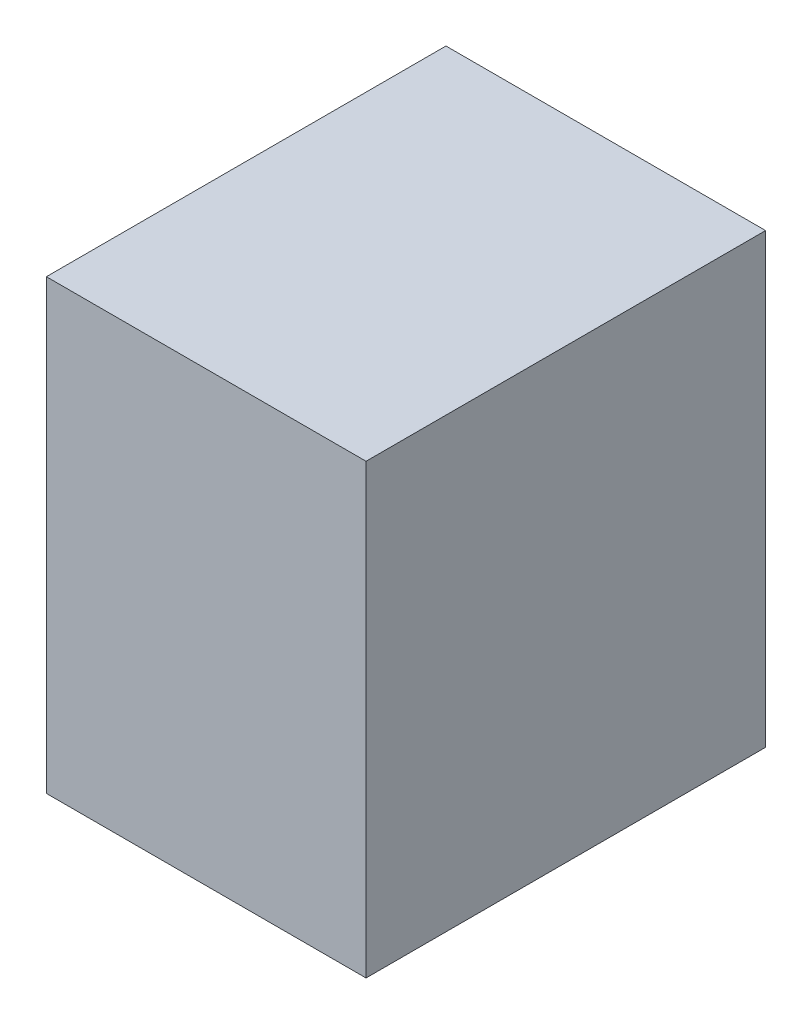
ISO-10303-21;
HEADER;
FILE_DESCRIPTION(('STEP AP214'),'2;1');
FILE_NAME('part.step','',(''),(''),'','','');
FILE_SCHEMA(('AUTOMOTIVE_DESIGN { 1 0 10303 214 1 1 1 1 }'));
ENDSEC;
DATA;
#1=APPLICATION_CONTEXT('core data for automotive mechanical design processes');
#2=APPLICATION_PROTOCOL_DEFINITION('international standard','automotive_design',2000,#1);
#3=PRODUCT_CONTEXT('',#1,'mechanical');
#4=PRODUCT('Part','Part','',(#3));
#5=PRODUCT_RELATED_PRODUCT_CATEGORY('part','',(#4));
#6=PRODUCT_DEFINITION_FORMATION('','',#4);
#7=PRODUCT_DEFINITION_CONTEXT('part definition',#1,'design');
#8=PRODUCT_DEFINITION('design','',#6,#7);
#9=PRODUCT_DEFINITION_SHAPE('','',#8);
#10=(LENGTH_UNIT() NAMED_UNIT(*) SI_UNIT(.MILLI.,.METRE.));
#11=(NAMED_UNIT(*) PLANE_ANGLE_UNIT() SI_UNIT($,.RADIAN.));
#12=(NAMED_UNIT(*) SI_UNIT($,.STERADIAN.) SOLID_ANGLE_UNIT());
#13=UNCERTAINTY_MEASURE_WITH_UNIT(LENGTH_MEASURE(1.E-05),#10,'distance_accuracy_value','');
#14=(GEOMETRIC_REPRESENTATION_CONTEXT(3) GLOBAL_UNCERTAINTY_ASSIGNED_CONTEXT((#13)) GLOBAL_UNIT_ASSIGNED_CONTEXT((#10,
#11,#12)) REPRESENTATION_CONTEXT('',''));
#15=CARTESIAN_POINT('',(0.,0.,0.));
#16=DIRECTION('',(0.,0.,1.));
#17=DIRECTION('',(1.,0.,0.));
#18=AXIS2_PLACEMENT_3D('',#15,#16,#17);
#19=CARTESIAN_POINT('',(0.,280.,0.));
#20=DIRECTION('',(1.,0.,0.));
#21=DIRECTION('',(0.,0.,-1.));
#22=AXIS2_PLACEMENT_3D('',#19,#20,#21);
#23=PLANE('',#22);
#24=DIRECTION('',(0.,0.,1.));
#25=VECTOR('',#24,1.);
#26=CARTESIAN_POINT('',(0.,0.,0.));
#27=LINE('',#26,#25);
#28=CARTESIAN_POINT('',(0.,0.,-250.));
#29=VERTEX_POINT('',#28);
#30=CARTESIAN_POINT('',(0.,0.,0.));
#31=VERTEX_POINT('',#30);
#32=EDGE_CURVE('E98',#29,#31,#27,.T.);
#33=ORIENTED_EDGE('',*,*,#32,.T.);
#34=DIRECTION('',(0.,-1.,0.));
#35=VECTOR('',#34,1.);
#36=CARTESIAN_POINT('',(0.,280.,0.));
#37=LINE('',#36,#35);
#38=CARTESIAN_POINT('',(0.,280.,0.));
#39=VERTEX_POINT('',#38);
#40=EDGE_CURVE('E11',#39,#31,#37,.T.);
#41=ORIENTED_EDGE('',*,*,#40,.F.);
#42=DIRECTION('',(0.,0.,1.));
#43=VECTOR('',#42,1.);
#44=CARTESIAN_POINT('',(0.,280.,0.));
#45=LINE('',#44,#43);
#46=CARTESIAN_POINT('',(0.,280.,-250.));
#47=VERTEX_POINT('',#46);
#48=EDGE_CURVE('E86',#47,#39,#45,.T.);
#49=ORIENTED_EDGE('',*,*,#48,.F.);
#50=DIRECTION('',(0.,-1.,0.));
#51=VECTOR('',#50,1.);
#52=CARTESIAN_POINT('',(0.,280.,-250.));
#53=LINE('',#52,#51);
#54=EDGE_CURVE('E94',#47,#29,#53,.T.);
#55=ORIENTED_EDGE('',*,*,#54,.T.);
#56=EDGE_LOOP('',(#33,#41,#49,#55));
#57=FACE_BOUND('',#56,.T.);
#58=ADVANCED_FACE('F35',(#57),#23,.F.);
#59=CARTESIAN_POINT('',(0.,280.,0.));
#60=DIRECTION('',(0.,0.,-1.));
#61=DIRECTION('',(-1.,0.,0.));
#62=AXIS2_PLACEMENT_3D('',#59,#60,#61);
#63=PLANE('',#62);
#64=DIRECTION('',(1.,0.,0.));
#65=VECTOR('',#64,1.);
#66=CARTESIAN_POINT('',(0.,0.,0.));
#67=LINE('',#66,#65);
#68=CARTESIAN_POINT('',(200.,0.,0.));
#69=VERTEX_POINT('',#68);
#70=EDGE_CURVE('E90',#31,#69,#67,.T.);
#71=ORIENTED_EDGE('',*,*,#70,.T.);
#72=DIRECTION('',(0.,-1.,0.));
#73=VECTOR('',#72,1.);
#74=CARTESIAN_POINT('',(200.,280.,0.));
#75=LINE('',#74,#73);
#76=CARTESIAN_POINT('',(200.,280.,0.));
#77=VERTEX_POINT('',#76);
#78=EDGE_CURVE('E43',#77,#69,#75,.T.);
#79=ORIENTED_EDGE('',*,*,#78,.F.);
#80=DIRECTION('',(1.,0.,0.));
#81=VECTOR('',#80,1.);
#82=CARTESIAN_POINT('',(0.,280.,0.));
#83=LINE('',#82,#81);
#84=EDGE_CURVE('E81',#39,#77,#83,.T.);
#85=ORIENTED_EDGE('',*,*,#84,.F.);
#86=ORIENTED_EDGE('',*,*,#40,.T.);
#87=EDGE_LOOP('',(#71,#79,#85,#86));
#88=FACE_BOUND('',#87,.T.);
#89=ADVANCED_FACE('F89',(#88),#63,.F.);
#90=CARTESIAN_POINT('',(200.,280.,0.));
#91=DIRECTION('',(-1.,0.,0.));
#92=DIRECTION('',(0.,0.,1.));
#93=AXIS2_PLACEMENT_3D('',#90,#91,#92);
#94=PLANE('',#93);
#95=DIRECTION('',(0.,0.,-1.));
#96=VECTOR('',#95,1.);
#97=CARTESIAN_POINT('',(200.,0.,0.));
#98=LINE('',#97,#96);
#99=CARTESIAN_POINT('',(200.,0.,-250.));
#100=VERTEX_POINT('',#99);
#101=EDGE_CURVE('E68',#69,#100,#98,.T.);
#102=ORIENTED_EDGE('',*,*,#101,.T.);
#103=DIRECTION('',(0.,-1.,0.));
#104=VECTOR('',#103,1.);
#105=CARTESIAN_POINT('',(200.,280.,-250.));
#106=LINE('',#105,#104);
#107=CARTESIAN_POINT('',(200.,280.,-250.));
#108=VERTEX_POINT('',#107);
#109=EDGE_CURVE('E91',#108,#100,#106,.T.);
#110=ORIENTED_EDGE('',*,*,#109,.F.);
#111=DIRECTION('',(0.,0.,-1.));
#112=VECTOR('',#111,1.);
#113=CARTESIAN_POINT('',(200.,280.,0.));
#114=LINE('',#113,#112);
#115=EDGE_CURVE('E84',#77,#108,#114,.T.);
#116=ORIENTED_EDGE('',*,*,#115,.F.);
#117=ORIENTED_EDGE('',*,*,#78,.T.);
#118=EDGE_LOOP('',(#102,#110,#116,#117));
#119=FACE_BOUND('',#118,.T.);
#120=ADVANCED_FACE('F92',(#119),#94,.F.);
#121=CARTESIAN_POINT('',(0.,280.,-250.));
#122=DIRECTION('',(0.,0.,1.));
#123=DIRECTION('',(1.,0.,0.));
#124=AXIS2_PLACEMENT_3D('',#121,#122,#123);
#125=PLANE('',#124);
#126=DIRECTION('',(-1.,0.,0.));
#127=VECTOR('',#126,1.);
#128=CARTESIAN_POINT('',(0.,0.,-250.));
#129=LINE('',#128,#127);
#130=EDGE_CURVE('E74',#100,#29,#129,.T.);
#131=ORIENTED_EDGE('',*,*,#130,.T.);
#132=ORIENTED_EDGE('',*,*,#54,.F.);
#133=DIRECTION('',(-1.,0.,0.));
#134=VECTOR('',#133,1.);
#135=CARTESIAN_POINT('',(0.,280.,-250.));
#136=LINE('',#135,#134);
#137=EDGE_CURVE('E51',#108,#47,#136,.T.);
#138=ORIENTED_EDGE('',*,*,#137,.F.);
#139=ORIENTED_EDGE('',*,*,#109,.T.);
#140=EDGE_LOOP('',(#131,#132,#138,#139));
#141=FACE_BOUND('',#140,.T.);
#142=ADVANCED_FACE('F105',(#141),#125,.F.);
#143=CARTESIAN_POINT('',(0.,280.,0.));
#144=DIRECTION('',(0.,-1.,0.));
#145=DIRECTION('',(0.,0.,-1.));
#146=AXIS2_PLACEMENT_3D('',#143,#144,#145);
#147=PLANE('',#146);
#148=ORIENTED_EDGE('',*,*,#48,.T.);
#149=ORIENTED_EDGE('',*,*,#84,.T.);
#150=ORIENTED_EDGE('',*,*,#115,.T.);
#151=ORIENTED_EDGE('',*,*,#137,.T.);
#152=EDGE_LOOP('',(#148,#149,#150,#151));
#153=FACE_BOUND('',#152,.T.);
#154=ADVANCED_FACE('F82',(#153),#147,.F.);
#155=CARTESIAN_POINT('',(0.,0.,0.));
#156=DIRECTION('',(0.,-1.,0.));
#157=DIRECTION('',(0.,0.,-1.));
#158=AXIS2_PLACEMENT_3D('',#155,#156,#157);
#159=PLANE('',#158);
#160=ORIENTED_EDGE('',*,*,#32,.F.);
#161=ORIENTED_EDGE('',*,*,#130,.F.);
#162=ORIENTED_EDGE('',*,*,#101,.F.);
#163=ORIENTED_EDGE('',*,*,#70,.F.);
#164=EDGE_LOOP('',(#160,#161,#162,#163));
#165=FACE_BOUND('',#164,.T.);
#166=ADVANCED_FACE('F108',(#165),#159,.T.);
#167=CLOSED_SHELL('',(#58,#89,#120,#142,#154,#166));
#168=MANIFOLD_SOLID_BREP('B2',#167);
#169=ADVANCED_BREP_SHAPE_REPRESENTATION('',(#18,#168),#14);
#170=SHAPE_DEFINITION_REPRESENTATION(#9,#169);
ENDSEC;
END-ISO-10303-21;
